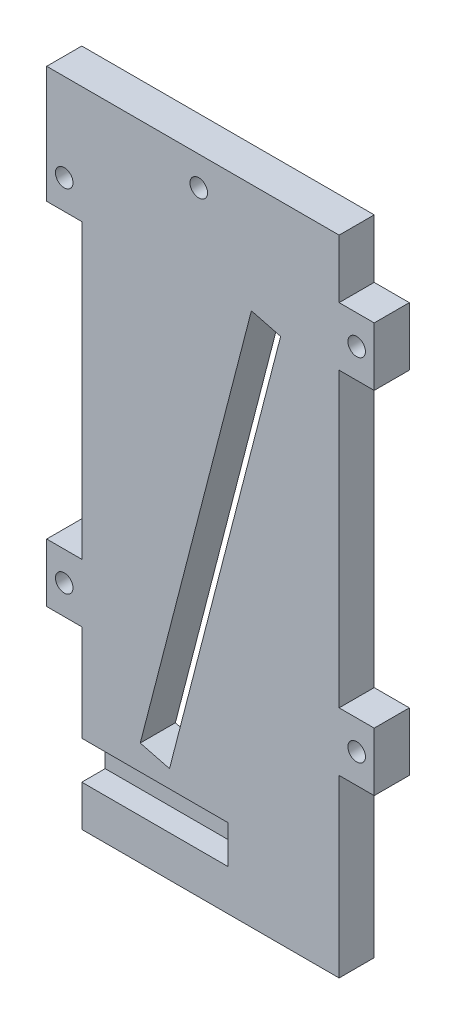
ISO-10303-21;
HEADER;
FILE_DESCRIPTION(('STEP AP214'),'2;1');
FILE_NAME('part.step','',(''),(''),'','','');
FILE_SCHEMA(('AUTOMOTIVE_DESIGN { 1 0 10303 214 1 1 1 1 }'));
ENDSEC;
DATA;
#1=APPLICATION_CONTEXT('core data for automotive mechanical design processes');
#2=APPLICATION_PROTOCOL_DEFINITION('international standard','automotive_design',2000,#1);
#3=PRODUCT_CONTEXT('',#1,'mechanical');
#4=PRODUCT('Part','Part','',(#3));
#5=PRODUCT_RELATED_PRODUCT_CATEGORY('part','',(#4));
#6=PRODUCT_DEFINITION_FORMATION('','',#4);
#7=PRODUCT_DEFINITION_CONTEXT('part definition',#1,'design');
#8=PRODUCT_DEFINITION('design','',#6,#7);
#9=PRODUCT_DEFINITION_SHAPE('','',#8);
#10=(LENGTH_UNIT() NAMED_UNIT(*) SI_UNIT(.MILLI.,.METRE.));
#11=(NAMED_UNIT(*) PLANE_ANGLE_UNIT() SI_UNIT($,.RADIAN.));
#12=(NAMED_UNIT(*) SI_UNIT($,.STERADIAN.) SOLID_ANGLE_UNIT());
#13=UNCERTAINTY_MEASURE_WITH_UNIT(LENGTH_MEASURE(1.E-05),#10,'distance_accuracy_value','');
#14=(GEOMETRIC_REPRESENTATION_CONTEXT(3) GLOBAL_UNCERTAINTY_ASSIGNED_CONTEXT((#13)) GLOBAL_UNIT_ASSIGNED_CONTEXT((#10,
#11,#12)) REPRESENTATION_CONTEXT('',''));
#15=CARTESIAN_POINT('',(0.,0.,0.));
#16=DIRECTION('',(0.,0.,1.));
#17=DIRECTION('',(1.,0.,0.));
#18=AXIS2_PLACEMENT_3D('',#15,#16,#17);
#19=CARTESIAN_POINT('',(-3.,75.,6.));
#20=DIRECTION('',(0.,0.,-1.));
#21=DIRECTION('',(-1.,0.,0.));
#22=AXIS2_PLACEMENT_3D('',#19,#20,#21);
#23=CYLINDRICAL_SURFACE('',#22,1.5);
#24=CARTESIAN_POINT('',(-3.,75.,6.));
#25=DIRECTION('',(0.,0.,-1.));
#26=DIRECTION('',(-1.,0.,0.));
#27=AXIS2_PLACEMENT_3D('',#24,#25,#26);
#28=CIRCLE('',#27,1.5);
#29=CARTESIAN_POINT('',(-4.5,75.,6.));
#30=VERTEX_POINT('',#29);
#31=EDGE_CURVE('E323',#30,#30,#28,.T.);
#32=ORIENTED_EDGE('',*,*,#31,.F.);
#33=EDGE_LOOP('',(#32));
#34=FACE_BOUND('',#33,.T.);
#35=CARTESIAN_POINT('',(-3.,75.,3.));
#36=DIRECTION('',(0.,0.,-1.));
#37=DIRECTION('',(-1.,0.,0.));
#38=AXIS2_PLACEMENT_3D('',#35,#36,#37);
#39=CIRCLE('',#38,1.5);
#40=CARTESIAN_POINT('',(-4.5,75.,3.));
#41=VERTEX_POINT('',#40);
#42=EDGE_CURVE('E303',#41,#41,#39,.F.);
#43=ORIENTED_EDGE('',*,*,#42,.F.);
#44=EDGE_LOOP('',(#43));
#45=FACE_BOUND('',#44,.T.);
#46=ADVANCED_FACE('F35',(#34,#45),#23,.F.);
#47=CARTESIAN_POINT('',(-3.,15.,6.));
#48=DIRECTION('',(0.,0.,-1.));
#49=DIRECTION('',(-1.,0.,0.));
#50=AXIS2_PLACEMENT_3D('',#47,#48,#49);
#51=CYLINDRICAL_SURFACE('',#50,1.5);
#52=CARTESIAN_POINT('',(-3.,15.,6.));
#53=DIRECTION('',(0.,0.,-1.));
#54=DIRECTION('',(-1.,0.,0.));
#55=AXIS2_PLACEMENT_3D('',#52,#53,#54);
#56=CIRCLE('',#55,1.5);
#57=CARTESIAN_POINT('',(-4.5,15.,6.));
#58=VERTEX_POINT('',#57);
#59=EDGE_CURVE('E320',#58,#58,#56,.T.);
#60=ORIENTED_EDGE('',*,*,#59,.F.);
#61=EDGE_LOOP('',(#60));
#62=FACE_BOUND('',#61,.T.);
#63=CARTESIAN_POINT('',(-3.,15.,3.));
#64=DIRECTION('',(0.,0.,-1.));
#65=DIRECTION('',(-1.,0.,0.));
#66=AXIS2_PLACEMENT_3D('',#63,#64,#65);
#67=CIRCLE('',#66,1.5);
#68=CARTESIAN_POINT('',(-4.5,15.,3.));
#69=VERTEX_POINT('',#68);
#70=EDGE_CURVE('E310',#69,#69,#67,.F.);
#71=ORIENTED_EDGE('',*,*,#70,.F.);
#72=EDGE_LOOP('',(#71));
#73=FACE_BOUND('',#72,.T.);
#74=ADVANCED_FACE('F473',(#62,#73),#51,.F.);
#75=CARTESIAN_POINT('',(0.,0.,6.));
#76=DIRECTION('',(1.,0.,0.));
#77=DIRECTION('',(0.,0.,-1.));
#78=AXIS2_PLACEMENT_3D('',#75,#76,#77);
#79=PLANE('',#78);
#80=DIRECTION('',(0.,-1.,0.));
#81=VECTOR('',#80,1.);
#82=CARTESIAN_POINT('',(0.,-13.,2.));
#83=LINE('',#82,#81);
#84=CARTESIAN_POINT('',(0.,-6.5,2.));
#85=VERTEX_POINT('',#84);
#86=CARTESIAN_POINT('',(0.,-13.,2.));
#87=VERTEX_POINT('',#86);
#88=EDGE_CURVE('E247',#85,#87,#83,.T.);
#89=ORIENTED_EDGE('',*,*,#88,.F.);
#90=DIRECTION('',(0.,0.,1.));
#91=VECTOR('',#90,1.);
#92=CARTESIAN_POINT('',(0.,-6.5,2.));
#93=LINE('',#92,#91);
#94=CARTESIAN_POINT('',(0.,-6.5,6.));
#95=VERTEX_POINT('',#94);
#96=EDGE_CURVE('E267',#85,#95,#93,.T.);
#97=ORIENTED_EDGE('',*,*,#96,.T.);
#98=DIRECTION('',(0.,-1.,0.));
#99=VECTOR('',#98,1.);
#100=CARTESIAN_POINT('',(0.,0.,6.));
#101=LINE('',#100,#99);
#102=CARTESIAN_POINT('',(0.,10.,6.));
#103=VERTEX_POINT('',#102);
#104=EDGE_CURVE('E333',#103,#95,#101,.T.);
#105=ORIENTED_EDGE('',*,*,#104,.F.);
#106=DIRECTION('',(0.,0.,-1.));
#107=VECTOR('',#106,1.);
#108=CARTESIAN_POINT('',(0.,10.,6.));
#109=LINE('',#108,#107);
#110=CARTESIAN_POINT('',(0.,10.,0.));
#111=VERTEX_POINT('',#110);
#112=EDGE_CURVE('E369',#103,#111,#109,.T.);
#113=ORIENTED_EDGE('',*,*,#112,.T.);
#114=DIRECTION('',(0.,-1.,0.));
#115=VECTOR('',#114,1.);
#116=CARTESIAN_POINT('',(0.,0.,0.));
#117=LINE('',#116,#115);
#118=CARTESIAN_POINT('',(0.,-20.,0.));
#119=VERTEX_POINT('',#118);
#120=EDGE_CURVE('E330',#111,#119,#117,.T.);
#121=ORIENTED_EDGE('',*,*,#120,.T.);
#122=DIRECTION('',(0.,0.,1.));
#123=VECTOR('',#122,1.);
#124=CARTESIAN_POINT('',(0.,-20.,0.));
#125=LINE('',#124,#123);
#126=CARTESIAN_POINT('',(0.,-20.,6.));
#127=VERTEX_POINT('',#126);
#128=EDGE_CURVE('E279',#119,#127,#125,.T.);
#129=ORIENTED_EDGE('',*,*,#128,.T.);
#130=CARTESIAN_POINT('',(0.,-13.,6.));
#131=VERTEX_POINT('',#130);
#132=EDGE_CURVE('E337',#131,#127,#101,.T.);
#133=ORIENTED_EDGE('',*,*,#132,.F.);
#134=DIRECTION('',(0.,0.,1.));
#135=VECTOR('',#134,1.);
#136=CARTESIAN_POINT('',(0.,-13.,2.));
#137=LINE('',#136,#135);
#138=EDGE_CURVE('E260',#87,#131,#137,.T.);
#139=ORIENTED_EDGE('',*,*,#138,.F.);
#140=EDGE_LOOP('',(#89,#97,#105,#113,#121,#129,#133,#139));
#141=FACE_BOUND('',#140,.T.);
#142=ADVANCED_FACE('F37',(#141),#79,.F.);
#143=CARTESIAN_POINT('',(44.,0.,6.));
#144=DIRECTION('',(-1.,0.,0.));
#145=DIRECTION('',(0.,0.,1.));
#146=AXIS2_PLACEMENT_3D('',#143,#144,#145);
#147=PLANE('',#146);
#148=DIRECTION('',(0.,1.,0.));
#149=VECTOR('',#148,1.);
#150=CARTESIAN_POINT('',(44.,0.,0.));
#151=LINE('',#150,#149);
#152=CARTESIAN_POINT('',(44.,-20.,0.));
#153=VERTEX_POINT('',#152);
#154=CARTESIAN_POINT('',(44.,10.,0.));
#155=VERTEX_POINT('',#154);
#156=EDGE_CURVE('E371',#153,#155,#151,.T.);
#157=ORIENTED_EDGE('',*,*,#156,.T.);
#158=DIRECTION('',(0.,0.,-1.));
#159=VECTOR('',#158,1.);
#160=CARTESIAN_POINT('',(44.,10.,6.));
#161=LINE('',#160,#159);
#162=CARTESIAN_POINT('',(44.,10.,6.));
#163=VERTEX_POINT('',#162);
#164=EDGE_CURVE('E11',#163,#155,#161,.T.);
#165=ORIENTED_EDGE('',*,*,#164,.F.);
#166=DIRECTION('',(0.,1.,0.));
#167=VECTOR('',#166,1.);
#168=CARTESIAN_POINT('',(44.,0.,6.));
#169=LINE('',#168,#167);
#170=CARTESIAN_POINT('',(44.,-20.,6.));
#171=VERTEX_POINT('',#170);
#172=EDGE_CURVE('E336',#171,#163,#169,.T.);
#173=ORIENTED_EDGE('',*,*,#172,.F.);
#174=DIRECTION('',(0.,0.,1.));
#175=VECTOR('',#174,1.);
#176=CARTESIAN_POINT('',(44.,-20.,0.));
#177=LINE('',#176,#175);
#178=EDGE_CURVE('E282',#153,#171,#177,.T.);
#179=ORIENTED_EDGE('',*,*,#178,.F.);
#180=EDGE_LOOP('',(#157,#165,#173,#179));
#181=FACE_BOUND('',#180,.T.);
#182=ADVANCED_FACE('F554',(#181),#147,.F.);
#183=CARTESIAN_POINT('',(44.,10.,6.));
#184=DIRECTION('',(0.,1.,0.));
#185=DIRECTION('',(0.,0.,1.));
#186=AXIS2_PLACEMENT_3D('',#183,#184,#185);
#187=PLANE('',#186);
#188=DIRECTION('',(1.,0.,0.));
#189=VECTOR('',#188,1.);
#190=CARTESIAN_POINT('',(44.,10.,0.));
#191=LINE('',#190,#189);
#192=CARTESIAN_POINT('',(50.,10.,0.));
#193=VERTEX_POINT('',#192);
#194=EDGE_CURVE('E373',#155,#193,#191,.T.);
#195=ORIENTED_EDGE('',*,*,#194,.T.);
#196=DIRECTION('',(0.,0.,-1.));
#197=VECTOR('',#196,1.);
#198=CARTESIAN_POINT('',(50.,10.,6.));
#199=LINE('',#198,#197);
#200=CARTESIAN_POINT('',(50.,10.,6.));
#201=VERTEX_POINT('',#200);
#202=EDGE_CURVE('E44',#201,#193,#199,.T.);
#203=ORIENTED_EDGE('',*,*,#202,.F.);
#204=DIRECTION('',(1.,0.,0.));
#205=VECTOR('',#204,1.);
#206=CARTESIAN_POINT('',(44.,10.,6.));
#207=LINE('',#206,#205);
#208=EDGE_CURVE('E339',#163,#201,#207,.T.);
#209=ORIENTED_EDGE('',*,*,#208,.F.);
#210=ORIENTED_EDGE('',*,*,#164,.T.);
#211=EDGE_LOOP('',(#195,#203,#209,#210));
#212=FACE_BOUND('',#211,.T.);
#213=ADVANCED_FACE('F551',(#212),#187,.F.);
#214=CARTESIAN_POINT('',(50.,10.,6.));
#215=DIRECTION('',(-1.,0.,0.));
#216=DIRECTION('',(0.,0.,1.));
#217=AXIS2_PLACEMENT_3D('',#214,#215,#216);
#218=PLANE('',#217);
#219=DIRECTION('',(0.,1.,0.));
#220=VECTOR('',#219,1.);
#221=CARTESIAN_POINT('',(50.,10.,0.));
#222=LINE('',#221,#220);
#223=CARTESIAN_POINT('',(50.,20.,0.));
#224=VERTEX_POINT('',#223);
#225=EDGE_CURVE('E375',#193,#224,#222,.T.);
#226=ORIENTED_EDGE('',*,*,#225,.T.);
#227=DIRECTION('',(0.,0.,-1.));
#228=VECTOR('',#227,1.);
#229=CARTESIAN_POINT('',(50.,20.,6.));
#230=LINE('',#229,#228);
#231=CARTESIAN_POINT('',(50.,20.,6.));
#232=VERTEX_POINT('',#231);
#233=EDGE_CURVE('E441',#232,#224,#230,.T.);
#234=ORIENTED_EDGE('',*,*,#233,.F.);
#235=DIRECTION('',(0.,1.,0.));
#236=VECTOR('',#235,1.);
#237=CARTESIAN_POINT('',(50.,10.,6.));
#238=LINE('',#237,#236);
#239=EDGE_CURVE('E341',#201,#232,#238,.T.);
#240=ORIENTED_EDGE('',*,*,#239,.F.);
#241=ORIENTED_EDGE('',*,*,#202,.T.);
#242=EDGE_LOOP('',(#226,#234,#240,#241));
#243=FACE_BOUND('',#242,.T.);
#244=ADVANCED_FACE('F547',(#243),#218,.F.);
#245=CARTESIAN_POINT('',(44.,20.,6.));
#246=DIRECTION('',(0.,-1.,0.));
#247=DIRECTION('',(0.,0.,-1.));
#248=AXIS2_PLACEMENT_3D('',#245,#246,#247);
#249=PLANE('',#248);
#250=DIRECTION('',(-1.,0.,0.));
#251=VECTOR('',#250,1.);
#252=CARTESIAN_POINT('',(44.,20.,0.));
#253=LINE('',#252,#251);
#254=CARTESIAN_POINT('',(44.,20.,0.));
#255=VERTEX_POINT('',#254);
#256=EDGE_CURVE('E377',#224,#255,#253,.T.);
#257=ORIENTED_EDGE('',*,*,#256,.T.);
#258=DIRECTION('',(0.,0.,-1.));
#259=VECTOR('',#258,1.);
#260=CARTESIAN_POINT('',(44.,20.,6.));
#261=LINE('',#260,#259);
#262=CARTESIAN_POINT('',(44.,20.,6.));
#263=VERTEX_POINT('',#262);
#264=EDGE_CURVE('E438',#263,#255,#261,.T.);
#265=ORIENTED_EDGE('',*,*,#264,.F.);
#266=DIRECTION('',(-1.,0.,0.));
#267=VECTOR('',#266,1.);
#268=CARTESIAN_POINT('',(44.,20.,6.));
#269=LINE('',#268,#267);
#270=EDGE_CURVE('E343',#232,#263,#269,.T.);
#271=ORIENTED_EDGE('',*,*,#270,.F.);
#272=ORIENTED_EDGE('',*,*,#233,.T.);
#273=EDGE_LOOP('',(#257,#265,#271,#272));
#274=FACE_BOUND('',#273,.T.);
#275=ADVANCED_FACE('F543',(#274),#249,.F.);
#276=CARTESIAN_POINT('',(44.,20.,6.));
#277=DIRECTION('',(-1.,0.,0.));
#278=DIRECTION('',(0.,-1.,0.));
#279=AXIS2_PLACEMENT_3D('',#276,#277,#278);
#280=PLANE('',#279);
#281=DIRECTION('',(0.,1.,0.));
#282=VECTOR('',#281,1.);
#283=CARTESIAN_POINT('',(44.,20.,0.));
#284=LINE('',#283,#282);
#285=CARTESIAN_POINT('',(44.,70.,0.));
#286=VERTEX_POINT('',#285);
#287=EDGE_CURVE('E379',#255,#286,#284,.T.);
#288=ORIENTED_EDGE('',*,*,#287,.T.);
#289=DIRECTION('',(0.,0.,-1.));
#290=VECTOR('',#289,1.);
#291=CARTESIAN_POINT('',(44.,70.,6.));
#292=LINE('',#291,#290);
#293=CARTESIAN_POINT('',(44.,70.,6.));
#294=VERTEX_POINT('',#293);
#295=EDGE_CURVE('E435',#294,#286,#292,.T.);
#296=ORIENTED_EDGE('',*,*,#295,.F.);
#297=DIRECTION('',(0.,1.,0.));
#298=VECTOR('',#297,1.);
#299=CARTESIAN_POINT('',(44.,20.,6.));
#300=LINE('',#299,#298);
#301=EDGE_CURVE('E345',#263,#294,#300,.T.);
#302=ORIENTED_EDGE('',*,*,#301,.F.);
#303=ORIENTED_EDGE('',*,*,#264,.T.);
#304=EDGE_LOOP('',(#288,#296,#302,#303));
#305=FACE_BOUND('',#304,.T.);
#306=ADVANCED_FACE('F539',(#305),#280,.F.);
#307=CARTESIAN_POINT('',(44.,70.,6.));
#308=DIRECTION('',(0.,1.,0.));
#309=DIRECTION('',(0.,0.,1.));
#310=AXIS2_PLACEMENT_3D('',#307,#308,#309);
#311=PLANE('',#310);
#312=DIRECTION('',(1.,0.,0.));
#313=VECTOR('',#312,1.);
#314=CARTESIAN_POINT('',(44.,70.,0.));
#315=LINE('',#314,#313);
#316=CARTESIAN_POINT('',(50.,70.,0.));
#317=VERTEX_POINT('',#316);
#318=EDGE_CURVE('E381',#286,#317,#315,.T.);
#319=ORIENTED_EDGE('',*,*,#318,.T.);
#320=DIRECTION('',(0.,0.,-1.));
#321=VECTOR('',#320,1.);
#322=CARTESIAN_POINT('',(50.,70.,6.));
#323=LINE('',#322,#321);
#324=CARTESIAN_POINT('',(50.,70.,6.));
#325=VERTEX_POINT('',#324);
#326=EDGE_CURVE('E432',#325,#317,#323,.T.);
#327=ORIENTED_EDGE('',*,*,#326,.F.);
#328=DIRECTION('',(1.,0.,0.));
#329=VECTOR('',#328,1.);
#330=CARTESIAN_POINT('',(44.,70.,6.));
#331=LINE('',#330,#329);
#332=EDGE_CURVE('E347',#294,#325,#331,.T.);
#333=ORIENTED_EDGE('',*,*,#332,.F.);
#334=ORIENTED_EDGE('',*,*,#295,.T.);
#335=EDGE_LOOP('',(#319,#327,#333,#334));
#336=FACE_BOUND('',#335,.T.);
#337=ADVANCED_FACE('F535',(#336),#311,.F.);
#338=CARTESIAN_POINT('',(50.,80.,6.));
#339=DIRECTION('',(-1.,0.,0.));
#340=DIRECTION('',(0.,0.,1.));
#341=AXIS2_PLACEMENT_3D('',#338,#339,#340);
#342=PLANE('',#341);
#343=DIRECTION('',(0.,1.,0.));
#344=VECTOR('',#343,1.);
#345=CARTESIAN_POINT('',(50.,80.,0.));
#346=LINE('',#345,#344);
#347=CARTESIAN_POINT('',(50.,80.,0.));
#348=VERTEX_POINT('',#347);
#349=EDGE_CURVE('E383',#317,#348,#346,.T.);
#350=ORIENTED_EDGE('',*,*,#349,.T.);
#351=DIRECTION('',(0.,0.,-1.));
#352=VECTOR('',#351,1.);
#353=CARTESIAN_POINT('',(50.,80.,6.));
#354=LINE('',#353,#352);
#355=CARTESIAN_POINT('',(50.,80.,6.));
#356=VERTEX_POINT('',#355);
#357=EDGE_CURVE('E429',#356,#348,#354,.T.);
#358=ORIENTED_EDGE('',*,*,#357,.F.);
#359=DIRECTION('',(0.,1.,0.));
#360=VECTOR('',#359,1.);
#361=CARTESIAN_POINT('',(50.,80.,6.));
#362=LINE('',#361,#360);
#363=EDGE_CURVE('E349',#325,#356,#362,.T.);
#364=ORIENTED_EDGE('',*,*,#363,.F.);
#365=ORIENTED_EDGE('',*,*,#326,.T.);
#366=EDGE_LOOP('',(#350,#358,#364,#365));
#367=FACE_BOUND('',#366,.T.);
#368=ADVANCED_FACE('F531',(#367),#342,.F.);
#369=CARTESIAN_POINT('',(44.,80.,6.));
#370=DIRECTION('',(0.,-1.,0.));
#371=DIRECTION('',(0.,0.,-1.));
#372=AXIS2_PLACEMENT_3D('',#369,#370,#371);
#373=PLANE('',#372);
#374=DIRECTION('',(-1.,0.,0.));
#375=VECTOR('',#374,1.);
#376=CARTESIAN_POINT('',(44.,80.,0.));
#377=LINE('',#376,#375);
#378=CARTESIAN_POINT('',(44.,80.,0.));
#379=VERTEX_POINT('',#378);
#380=EDGE_CURVE('E385',#348,#379,#377,.T.);
#381=ORIENTED_EDGE('',*,*,#380,.T.);
#382=DIRECTION('',(0.,0.,-1.));
#383=VECTOR('',#382,1.);
#384=CARTESIAN_POINT('',(44.,80.,6.));
#385=LINE('',#384,#383);
#386=CARTESIAN_POINT('',(44.,80.,6.));
#387=VERTEX_POINT('',#386);
#388=EDGE_CURVE('E426',#387,#379,#385,.T.);
#389=ORIENTED_EDGE('',*,*,#388,.F.);
#390=DIRECTION('',(-1.,0.,0.));
#391=VECTOR('',#390,1.);
#392=CARTESIAN_POINT('',(44.,80.,6.));
#393=LINE('',#392,#391);
#394=EDGE_CURVE('E351',#356,#387,#393,.T.);
#395=ORIENTED_EDGE('',*,*,#394,.F.);
#396=ORIENTED_EDGE('',*,*,#357,.T.);
#397=EDGE_LOOP('',(#381,#389,#395,#396));
#398=FACE_BOUND('',#397,.T.);
#399=ADVANCED_FACE('F527',(#398),#373,.F.);
#400=CARTESIAN_POINT('',(44.,80.,6.));
#401=DIRECTION('',(-1.,0.,0.));
#402=DIRECTION('',(0.,-1.,0.));
#403=AXIS2_PLACEMENT_3D('',#400,#401,#402);
#404=PLANE('',#403);
#405=DIRECTION('',(0.,1.,0.));
#406=VECTOR('',#405,1.);
#407=CARTESIAN_POINT('',(44.,80.,0.));
#408=LINE('',#407,#406);
#409=CARTESIAN_POINT('',(44.,90.,0.));
#410=VERTEX_POINT('',#409);
#411=EDGE_CURVE('E387',#379,#410,#408,.T.);
#412=ORIENTED_EDGE('',*,*,#411,.T.);
#413=DIRECTION('',(0.,0.,-1.));
#414=VECTOR('',#413,1.);
#415=CARTESIAN_POINT('',(44.,90.,6.));
#416=LINE('',#415,#414);
#417=CARTESIAN_POINT('',(44.,90.,6.));
#418=VERTEX_POINT('',#417);
#419=EDGE_CURVE('E423',#418,#410,#416,.T.);
#420=ORIENTED_EDGE('',*,*,#419,.F.);
#421=DIRECTION('',(0.,1.,0.));
#422=VECTOR('',#421,1.);
#423=CARTESIAN_POINT('',(44.,80.,6.));
#424=LINE('',#423,#422);
#425=EDGE_CURVE('E353',#387,#418,#424,.T.);
#426=ORIENTED_EDGE('',*,*,#425,.F.);
#427=ORIENTED_EDGE('',*,*,#388,.T.);
#428=EDGE_LOOP('',(#412,#420,#426,#427));
#429=FACE_BOUND('',#428,.T.);
#430=ADVANCED_FACE('F523',(#429),#404,.F.);
#431=CARTESIAN_POINT('',(-6.,90.,6.));
#432=DIRECTION('',(0.,-1.,0.));
#433=DIRECTION('',(0.,0.,-1.));
#434=AXIS2_PLACEMENT_3D('',#431,#432,#433);
#435=PLANE('',#434);
#436=DIRECTION('',(-1.,0.,0.));
#437=VECTOR('',#436,1.);
#438=CARTESIAN_POINT('',(-6.,90.,0.));
#439=LINE('',#438,#437);
#440=CARTESIAN_POINT('',(-6.,90.,0.));
#441=VERTEX_POINT('',#440);
#442=EDGE_CURVE('E389',#410,#441,#439,.T.);
#443=ORIENTED_EDGE('',*,*,#442,.T.);
#444=DIRECTION('',(0.,0.,-1.));
#445=VECTOR('',#444,1.);
#446=CARTESIAN_POINT('',(-6.,90.,6.));
#447=LINE('',#446,#445);
#448=CARTESIAN_POINT('',(-6.,90.,6.));
#449=VERTEX_POINT('',#448);
#450=EDGE_CURVE('E420',#449,#441,#447,.T.);
#451=ORIENTED_EDGE('',*,*,#450,.F.);
#452=DIRECTION('',(-1.,0.,0.));
#453=VECTOR('',#452,1.);
#454=CARTESIAN_POINT('',(-6.,90.,6.));
#455=LINE('',#454,#453);
#456=EDGE_CURVE('E355',#418,#449,#455,.T.);
#457=ORIENTED_EDGE('',*,*,#456,.F.);
#458=ORIENTED_EDGE('',*,*,#419,.T.);
#459=EDGE_LOOP('',(#443,#451,#457,#458));
#460=FACE_BOUND('',#459,.T.);
#461=ADVANCED_FACE('F519',(#460),#435,.F.);
#462=CARTESIAN_POINT('',(-6.,90.,6.));
#463=DIRECTION('',(1.,0.,0.));
#464=DIRECTION('',(0.,0.,-1.));
#465=AXIS2_PLACEMENT_3D('',#462,#463,#464);
#466=PLANE('',#465);
#467=DIRECTION('',(0.,-1.,0.));
#468=VECTOR('',#467,1.);
#469=CARTESIAN_POINT('',(-6.,90.,0.));
#470=LINE('',#469,#468);
#471=CARTESIAN_POINT('',(-6.,70.,0.));
#472=VERTEX_POINT('',#471);
#473=EDGE_CURVE('E391',#441,#472,#470,.T.);
#474=ORIENTED_EDGE('',*,*,#473,.T.);
#475=DIRECTION('',(0.,0.,-1.));
#476=VECTOR('',#475,1.);
#477=CARTESIAN_POINT('',(-6.,70.,6.));
#478=LINE('',#477,#476);
#479=CARTESIAN_POINT('',(-6.,70.,6.));
#480=VERTEX_POINT('',#479);
#481=EDGE_CURVE('E417',#480,#472,#478,.T.);
#482=ORIENTED_EDGE('',*,*,#481,.F.);
#483=DIRECTION('',(0.,-1.,0.));
#484=VECTOR('',#483,1.);
#485=CARTESIAN_POINT('',(-6.,90.,6.));
#486=LINE('',#485,#484);
#487=EDGE_CURVE('E357',#449,#480,#486,.T.);
#488=ORIENTED_EDGE('',*,*,#487,.F.);
#489=ORIENTED_EDGE('',*,*,#450,.T.);
#490=EDGE_LOOP('',(#474,#482,#488,#489));
#491=FACE_BOUND('',#490,.T.);
#492=ADVANCED_FACE('F515',(#491),#466,.F.);
#493=CARTESIAN_POINT('',(0.,70.,6.));
#494=DIRECTION('',(0.,1.,0.));
#495=DIRECTION('',(0.,0.,1.));
#496=AXIS2_PLACEMENT_3D('',#493,#494,#495);
#497=PLANE('',#496);
#498=DIRECTION('',(1.,0.,0.));
#499=VECTOR('',#498,1.);
#500=CARTESIAN_POINT('',(0.,70.,0.));
#501=LINE('',#500,#499);
#502=CARTESIAN_POINT('',(0.,70.,0.));
#503=VERTEX_POINT('',#502);
#504=EDGE_CURVE('E393',#472,#503,#501,.T.);
#505=ORIENTED_EDGE('',*,*,#504,.T.);
#506=DIRECTION('',(0.,0.,-1.));
#507=VECTOR('',#506,1.);
#508=CARTESIAN_POINT('',(0.,70.,6.));
#509=LINE('',#508,#507);
#510=CARTESIAN_POINT('',(0.,70.,6.));
#511=VERTEX_POINT('',#510);
#512=EDGE_CURVE('E414',#511,#503,#509,.T.);
#513=ORIENTED_EDGE('',*,*,#512,.F.);
#514=DIRECTION('',(1.,0.,0.));
#515=VECTOR('',#514,1.);
#516=CARTESIAN_POINT('',(0.,70.,6.));
#517=LINE('',#516,#515);
#518=EDGE_CURVE('E359',#480,#511,#517,.T.);
#519=ORIENTED_EDGE('',*,*,#518,.F.);
#520=ORIENTED_EDGE('',*,*,#481,.T.);
#521=EDGE_LOOP('',(#505,#513,#519,#520));
#522=FACE_BOUND('',#521,.T.);
#523=ADVANCED_FACE('F511',(#522),#497,.F.);
#524=CARTESIAN_POINT('',(0.,20.,6.));
#525=DIRECTION('',(1.,0.,0.));
#526=DIRECTION('',(0.,1.,0.));
#527=AXIS2_PLACEMENT_3D('',#524,#525,#526);
#528=PLANE('',#527);
#529=DIRECTION('',(0.,-1.,0.));
#530=VECTOR('',#529,1.);
#531=CARTESIAN_POINT('',(0.,20.,0.));
#532=LINE('',#531,#530);
#533=CARTESIAN_POINT('',(0.,20.,0.));
#534=VERTEX_POINT('',#533);
#535=EDGE_CURVE('E395',#503,#534,#532,.T.);
#536=ORIENTED_EDGE('',*,*,#535,.T.);
#537=DIRECTION('',(0.,0.,-1.));
#538=VECTOR('',#537,1.);
#539=CARTESIAN_POINT('',(0.,20.,6.));
#540=LINE('',#539,#538);
#541=CARTESIAN_POINT('',(0.,20.,6.));
#542=VERTEX_POINT('',#541);
#543=EDGE_CURVE('E411',#542,#534,#540,.T.);
#544=ORIENTED_EDGE('',*,*,#543,.F.);
#545=DIRECTION('',(0.,-1.,0.));
#546=VECTOR('',#545,1.);
#547=CARTESIAN_POINT('',(0.,20.,6.));
#548=LINE('',#547,#546);
#549=EDGE_CURVE('E361',#511,#542,#548,.T.);
#550=ORIENTED_EDGE('',*,*,#549,.F.);
#551=ORIENTED_EDGE('',*,*,#512,.T.);
#552=EDGE_LOOP('',(#536,#544,#550,#551));
#553=FACE_BOUND('',#552,.T.);
#554=ADVANCED_FACE('F507',(#553),#528,.F.);
#555=CARTESIAN_POINT('',(0.,20.,6.));
#556=DIRECTION('',(0.,-1.,0.));
#557=DIRECTION('',(0.,0.,-1.));
#558=AXIS2_PLACEMENT_3D('',#555,#556,#557);
#559=PLANE('',#558);
#560=DIRECTION('',(-1.,0.,0.));
#561=VECTOR('',#560,1.);
#562=CARTESIAN_POINT('',(0.,20.,0.));
#563=LINE('',#562,#561);
#564=CARTESIAN_POINT('',(-6.,20.,0.));
#565=VERTEX_POINT('',#564);
#566=EDGE_CURVE('E397',#534,#565,#563,.T.);
#567=ORIENTED_EDGE('',*,*,#566,.T.);
#568=DIRECTION('',(0.,0.,-1.));
#569=VECTOR('',#568,1.);
#570=CARTESIAN_POINT('',(-6.,20.,6.));
#571=LINE('',#570,#569);
#572=CARTESIAN_POINT('',(-6.,20.,6.));
#573=VERTEX_POINT('',#572);
#574=EDGE_CURVE('E408',#573,#565,#571,.T.);
#575=ORIENTED_EDGE('',*,*,#574,.F.);
#576=DIRECTION('',(-1.,0.,0.));
#577=VECTOR('',#576,1.);
#578=CARTESIAN_POINT('',(0.,20.,6.));
#579=LINE('',#578,#577);
#580=EDGE_CURVE('E363',#542,#573,#579,.T.);
#581=ORIENTED_EDGE('',*,*,#580,.F.);
#582=ORIENTED_EDGE('',*,*,#543,.T.);
#583=EDGE_LOOP('',(#567,#575,#581,#582));
#584=FACE_BOUND('',#583,.T.);
#585=ADVANCED_FACE('F503',(#584),#559,.F.);
#586=CARTESIAN_POINT('',(-6.,10.,6.));
#587=DIRECTION('',(1.,0.,0.));
#588=DIRECTION('',(0.,0.,-1.));
#589=AXIS2_PLACEMENT_3D('',#586,#587,#588);
#590=PLANE('',#589);
#591=DIRECTION('',(0.,-1.,0.));
#592=VECTOR('',#591,1.);
#593=CARTESIAN_POINT('',(-6.,10.,0.));
#594=LINE('',#593,#592);
#595=CARTESIAN_POINT('',(-6.,10.,0.));
#596=VERTEX_POINT('',#595);
#597=EDGE_CURVE('E399',#565,#596,#594,.T.);
#598=ORIENTED_EDGE('',*,*,#597,.T.);
#599=DIRECTION('',(0.,0.,-1.));
#600=VECTOR('',#599,1.);
#601=CARTESIAN_POINT('',(-6.,10.,6.));
#602=LINE('',#601,#600);
#603=CARTESIAN_POINT('',(-6.,10.,6.));
#604=VERTEX_POINT('',#603);
#605=EDGE_CURVE('E405',#604,#596,#602,.T.);
#606=ORIENTED_EDGE('',*,*,#605,.F.);
#607=DIRECTION('',(0.,-1.,0.));
#608=VECTOR('',#607,1.);
#609=CARTESIAN_POINT('',(-6.,10.,6.));
#610=LINE('',#609,#608);
#611=EDGE_CURVE('E365',#573,#604,#610,.T.);
#612=ORIENTED_EDGE('',*,*,#611,.F.);
#613=ORIENTED_EDGE('',*,*,#574,.T.);
#614=EDGE_LOOP('',(#598,#606,#612,#613));
#615=FACE_BOUND('',#614,.T.);
#616=ADVANCED_FACE('F499',(#615),#590,.F.);
#617=CARTESIAN_POINT('',(0.,10.,6.));
#618=DIRECTION('',(0.,1.,0.));
#619=DIRECTION('',(0.,0.,1.));
#620=AXIS2_PLACEMENT_3D('',#617,#618,#619);
#621=PLANE('',#620);
#622=DIRECTION('',(1.,0.,0.));
#623=VECTOR('',#622,1.);
#624=CARTESIAN_POINT('',(0.,10.,0.));
#625=LINE('',#624,#623);
#626=EDGE_CURVE('E401',#596,#111,#625,.T.);
#627=ORIENTED_EDGE('',*,*,#626,.T.);
#628=ORIENTED_EDGE('',*,*,#112,.F.);
#629=DIRECTION('',(1.,0.,0.));
#630=VECTOR('',#629,1.);
#631=CARTESIAN_POINT('',(0.,10.,6.));
#632=LINE('',#631,#630);
#633=EDGE_CURVE('E367',#604,#103,#632,.T.);
#634=ORIENTED_EDGE('',*,*,#633,.F.);
#635=ORIENTED_EDGE('',*,*,#605,.T.);
#636=EDGE_LOOP('',(#627,#628,#634,#635));
#637=FACE_BOUND('',#636,.T.);
#638=ADVANCED_FACE('F493',(#637),#621,.F.);
#639=CARTESIAN_POINT('',(0.,0.,6.));
#640=DIRECTION('',(0.,0.,1.));
#641=DIRECTION('',(1.,0.,0.));
#642=AXIS2_PLACEMENT_3D('',#639,#640,#641);
#643=PLANE('',#642);
#644=DIRECTION('',(-0.968174432456168,0.250276383900234,0.));
#645=VECTOR('',#644,1.);
#646=CARTESIAN_POINT('',(34.,70.,6.));
#647=LINE('',#646,#645);
#648=CARTESIAN_POINT('',(34.,70.,6.));
#649=VERTEX_POINT('',#648);
#650=CARTESIAN_POINT('',(29.,71.2925170068027,6.));
#651=VERTEX_POINT('',#650);
#652=EDGE_CURVE('E52',#649,#651,#647,.T.);
#653=ORIENTED_EDGE('',*,*,#652,.F.);
#654=DIRECTION('',(0.250276383900234,0.968174432456168,0.));
#655=VECTOR('',#654,1.);
#656=CARTESIAN_POINT('',(15.,-3.5,6.));
#657=LINE('',#656,#655);
#658=CARTESIAN_POINT('',(15.,-3.5,6.));
#659=VERTEX_POINT('',#658);
#660=EDGE_CURVE('E228',#659,#649,#657,.T.);
#661=ORIENTED_EDGE('',*,*,#660,.F.);
#662=DIRECTION('',(0.968174432456168,-0.250276383900234,0.));
#663=VECTOR('',#662,1.);
#664=CARTESIAN_POINT('',(10.,-2.20748299319728,6.));
#665=LINE('',#664,#663);
#666=CARTESIAN_POINT('',(10.,-2.20748299319728,6.));
#667=VERTEX_POINT('',#666);
#668=EDGE_CURVE('E231',#667,#659,#665,.T.);
#669=ORIENTED_EDGE('',*,*,#668,.F.);
#670=DIRECTION('',(-0.250276383900234,-0.968174432456168,0.));
#671=VECTOR('',#670,1.);
#672=CARTESIAN_POINT('',(29.,71.2925170068027,6.));
#673=LINE('',#672,#671);
#674=EDGE_CURVE('E237',#651,#667,#673,.T.);
#675=ORIENTED_EDGE('',*,*,#674,.F.);
#676=EDGE_LOOP('',(#653,#661,#669,#675));
#677=FACE_BOUND('',#676,.T.);
#678=DIRECTION('',(-1.,0.,0.));
#679=VECTOR('',#678,1.);
#680=CARTESIAN_POINT('',(0.,-6.5,6.));
#681=LINE('',#680,#679);
#682=CARTESIAN_POINT('',(25.,-6.5,6.));
#683=VERTEX_POINT('',#682);
#684=EDGE_CURVE('E251',#683,#95,#681,.T.);
#685=ORIENTED_EDGE('',*,*,#684,.F.);
#686=DIRECTION('',(0.,1.,0.));
#687=VECTOR('',#686,1.);
#688=CARTESIAN_POINT('',(25.,-13.,6.));
#689=LINE('',#688,#687);
#690=CARTESIAN_POINT('',(25.,-13.,6.));
#691=VERTEX_POINT('',#690);
#692=EDGE_CURVE('E263',#691,#683,#689,.T.);
#693=ORIENTED_EDGE('',*,*,#692,.F.);
#694=DIRECTION('',(1.,0.,0.));
#695=VECTOR('',#694,1.);
#696=CARTESIAN_POINT('',(0.,-13.,6.));
#697=LINE('',#696,#695);
#698=EDGE_CURVE('E243',#131,#691,#697,.T.);
#699=ORIENTED_EDGE('',*,*,#698,.F.);
#700=ORIENTED_EDGE('',*,*,#132,.T.);
#701=DIRECTION('',(1.,0.,0.));
#702=VECTOR('',#701,1.);
#703=CARTESIAN_POINT('',(0.,-20.,6.));
#704=LINE('',#703,#702);
#705=EDGE_CURVE('E270',#127,#171,#704,.T.);
#706=ORIENTED_EDGE('',*,*,#705,.T.);
#707=ORIENTED_EDGE('',*,*,#172,.T.);
#708=ORIENTED_EDGE('',*,*,#208,.T.);
#709=ORIENTED_EDGE('',*,*,#239,.T.);
#710=ORIENTED_EDGE('',*,*,#270,.T.);
#711=ORIENTED_EDGE('',*,*,#301,.T.);
#712=ORIENTED_EDGE('',*,*,#332,.T.);
#713=ORIENTED_EDGE('',*,*,#363,.T.);
#714=ORIENTED_EDGE('',*,*,#394,.T.);
#715=ORIENTED_EDGE('',*,*,#425,.T.);
#716=ORIENTED_EDGE('',*,*,#456,.T.);
#717=ORIENTED_EDGE('',*,*,#487,.T.);
#718=ORIENTED_EDGE('',*,*,#518,.T.);
#719=ORIENTED_EDGE('',*,*,#549,.T.);
#720=ORIENTED_EDGE('',*,*,#580,.T.);
#721=ORIENTED_EDGE('',*,*,#611,.T.);
#722=ORIENTED_EDGE('',*,*,#633,.T.);
#723=ORIENTED_EDGE('',*,*,#104,.T.);
#724=EDGE_LOOP('',(#685,#693,#699,#700,#706,#707,#708,#709,#710,#711,#712,#713,#714,#715,#716,
#717,#718,#719,#720,#721,#722,#723));
#725=FACE_BOUND('',#724,.T.);
#726=CARTESIAN_POINT('',(47.,75.,6.));
#727=DIRECTION('',(0.,0.,-1.));
#728=DIRECTION('',(1.,0.,0.));
#729=AXIS2_PLACEMENT_3D('',#726,#727,#728);
#730=CIRCLE('',#729,1.5);
#731=CARTESIAN_POINT('',(48.5,75.,6.));
#732=VERTEX_POINT('',#731);
#733=EDGE_CURVE('E314',#732,#732,#730,.T.);
#734=ORIENTED_EDGE('',*,*,#733,.T.);
#735=EDGE_LOOP('',(#734));
#736=FACE_BOUND('',#735,.T.);
#737=CARTESIAN_POINT('',(47.,15.,6.));
#738=DIRECTION('',(0.,0.,-1.));
#739=DIRECTION('',(1.,0.,0.));
#740=AXIS2_PLACEMENT_3D('',#737,#738,#739);
#741=CIRCLE('',#740,1.5);
#742=CARTESIAN_POINT('',(48.5,15.,6.));
#743=VERTEX_POINT('',#742);
#744=EDGE_CURVE('E317',#743,#743,#741,.T.);
#745=ORIENTED_EDGE('',*,*,#744,.T.);
#746=EDGE_LOOP('',(#745));
#747=FACE_BOUND('',#746,.T.);
#748=ORIENTED_EDGE('',*,*,#59,.T.);
#749=EDGE_LOOP('',(#748));
#750=FACE_BOUND('',#749,.T.);
#751=ORIENTED_EDGE('',*,*,#31,.T.);
#752=EDGE_LOOP('',(#751));
#753=FACE_BOUND('',#752,.T.);
#754=CARTESIAN_POINT('',(20.,85.,6.));
#755=DIRECTION('',(0.,0.,1.));
#756=DIRECTION('',(1.,0.,0.));
#757=AXIS2_PLACEMENT_3D('',#754,#755,#756);
#758=CIRCLE('',#757,1.5);
#759=CARTESIAN_POINT('',(21.5,85.,6.));
#760=VERTEX_POINT('',#759);
#761=EDGE_CURVE('E326',#760,#760,#758,.T.);
#762=ORIENTED_EDGE('',*,*,#761,.F.);
#763=EDGE_LOOP('',(#762));
#764=FACE_BOUND('',#763,.T.);
#765=ADVANCED_FACE('F490',(#677,#725,#736,#747,#750,#753,#764),#643,.T.);
#766=CARTESIAN_POINT('',(0.,0.,0.));
#767=DIRECTION('',(0.,0.,1.));
#768=DIRECTION('',(1.,0.,0.));
#769=AXIS2_PLACEMENT_3D('',#766,#767,#768);
#770=PLANE('',#769);
#771=DIRECTION('',(0.250276383900234,0.968174432456168,0.));
#772=VECTOR('',#771,1.);
#773=CARTESIAN_POINT('',(15.,-3.5,0.));
#774=LINE('',#773,#772);
#775=CARTESIAN_POINT('',(15.,-3.5,0.));
#776=VERTEX_POINT('',#775);
#777=CARTESIAN_POINT('',(34.,70.,0.));
#778=VERTEX_POINT('',#777);
#779=EDGE_CURVE('E218',#776,#778,#774,.T.);
#780=ORIENTED_EDGE('',*,*,#779,.T.);
#781=DIRECTION('',(-0.968174432456168,0.250276383900234,0.));
#782=VECTOR('',#781,1.);
#783=CARTESIAN_POINT('',(34.,70.,0.));
#784=LINE('',#783,#782);
#785=CARTESIAN_POINT('',(29.,71.2925170068027,0.));
#786=VERTEX_POINT('',#785);
#787=EDGE_CURVE('E212',#778,#786,#784,.T.);
#788=ORIENTED_EDGE('',*,*,#787,.T.);
#789=DIRECTION('',(-0.250276383900234,-0.968174432456168,0.));
#790=VECTOR('',#789,1.);
#791=CARTESIAN_POINT('',(29.,71.2925170068027,0.));
#792=LINE('',#791,#790);
#793=CARTESIAN_POINT('',(10.,-2.20748299319728,0.));
#794=VERTEX_POINT('',#793);
#795=EDGE_CURVE('E221',#786,#794,#792,.T.);
#796=ORIENTED_EDGE('',*,*,#795,.T.);
#797=DIRECTION('',(0.968174432456168,-0.250276383900234,0.));
#798=VECTOR('',#797,1.);
#799=CARTESIAN_POINT('',(10.,-2.20748299319728,0.));
#800=LINE('',#799,#798);
#801=EDGE_CURVE('E60',#794,#776,#800,.T.);
#802=ORIENTED_EDGE('',*,*,#801,.T.);
#803=EDGE_LOOP('',(#780,#788,#796,#802));
#804=FACE_BOUND('',#803,.T.);
#805=CARTESIAN_POINT('',(47.,15.,0.));
#806=DIRECTION('',(0.,0.,-1.));
#807=DIRECTION('',(1.,0.,0.));
#808=AXIS2_PLACEMENT_3D('',#805,#806,#807);
#809=CIRCLE('',#808,2.995);
#810=CARTESIAN_POINT('',(49.995,15.,0.));
#811=VERTEX_POINT('',#810);
#812=EDGE_CURVE('E285',#811,#811,#809,.T.);
#813=ORIENTED_EDGE('',*,*,#812,.F.);
#814=EDGE_LOOP('',(#813));
#815=FACE_BOUND('',#814,.T.);
#816=CARTESIAN_POINT('',(47.,75.,0.));
#817=DIRECTION('',(0.,0.,-1.));
#818=DIRECTION('',(1.,0.,0.));
#819=AXIS2_PLACEMENT_3D('',#816,#817,#818);
#820=CIRCLE('',#819,2.995);
#821=CARTESIAN_POINT('',(49.995,75.,0.));
#822=VERTEX_POINT('',#821);
#823=EDGE_CURVE('E297',#822,#822,#820,.T.);
#824=ORIENTED_EDGE('',*,*,#823,.F.);
#825=EDGE_LOOP('',(#824));
#826=FACE_BOUND('',#825,.T.);
#827=CARTESIAN_POINT('',(-3.,75.,0.));
#828=DIRECTION('',(0.,0.,-1.));
#829=DIRECTION('',(-1.,0.,0.));
#830=AXIS2_PLACEMENT_3D('',#827,#828,#829);
#831=CIRCLE('',#830,2.995);
#832=CARTESIAN_POINT('',(-5.995,75.,0.));
#833=VERTEX_POINT('',#832);
#834=EDGE_CURVE('E304',#833,#833,#831,.T.);
#835=ORIENTED_EDGE('',*,*,#834,.F.);
#836=EDGE_LOOP('',(#835));
#837=FACE_BOUND('',#836,.T.);
#838=CARTESIAN_POINT('',(-3.,15.,0.));
#839=DIRECTION('',(0.,0.,-1.));
#840=DIRECTION('',(-1.,0.,0.));
#841=AXIS2_PLACEMENT_3D('',#838,#839,#840);
#842=CIRCLE('',#841,2.995);
#843=CARTESIAN_POINT('',(-5.995,15.,0.));
#844=VERTEX_POINT('',#843);
#845=EDGE_CURVE('E311',#844,#844,#842,.T.);
#846=ORIENTED_EDGE('',*,*,#845,.F.);
#847=EDGE_LOOP('',(#846));
#848=FACE_BOUND('',#847,.T.);
#849=CARTESIAN_POINT('',(20.,85.,0.));
#850=DIRECTION('',(0.,0.,1.));
#851=DIRECTION('',(1.,0.,0.));
#852=AXIS2_PLACEMENT_3D('',#849,#850,#851);
#853=CIRCLE('',#852,1.5);
#854=CARTESIAN_POINT('',(21.5,85.,0.));
#855=VERTEX_POINT('',#854);
#856=EDGE_CURVE('E327',#855,#855,#853,.T.);
#857=ORIENTED_EDGE('',*,*,#856,.T.);
#858=EDGE_LOOP('',(#857));
#859=FACE_BOUND('',#858,.T.);
#860=ORIENTED_EDGE('',*,*,#120,.F.);
#861=ORIENTED_EDGE('',*,*,#626,.F.);
#862=ORIENTED_EDGE('',*,*,#597,.F.);
#863=ORIENTED_EDGE('',*,*,#566,.F.);
#864=ORIENTED_EDGE('',*,*,#535,.F.);
#865=ORIENTED_EDGE('',*,*,#504,.F.);
#866=ORIENTED_EDGE('',*,*,#473,.F.);
#867=ORIENTED_EDGE('',*,*,#442,.F.);
#868=ORIENTED_EDGE('',*,*,#411,.F.);
#869=ORIENTED_EDGE('',*,*,#380,.F.);
#870=ORIENTED_EDGE('',*,*,#349,.F.);
#871=ORIENTED_EDGE('',*,*,#318,.F.);
#872=ORIENTED_EDGE('',*,*,#287,.F.);
#873=ORIENTED_EDGE('',*,*,#256,.F.);
#874=ORIENTED_EDGE('',*,*,#225,.F.);
#875=ORIENTED_EDGE('',*,*,#194,.F.);
#876=ORIENTED_EDGE('',*,*,#156,.F.);
#877=DIRECTION('',(1.,0.,0.));
#878=VECTOR('',#877,1.);
#879=CARTESIAN_POINT('',(0.,-20.,0.));
#880=LINE('',#879,#878);
#881=EDGE_CURVE('E276',#119,#153,#880,.T.);
#882=ORIENTED_EDGE('',*,*,#881,.F.);
#883=EDGE_LOOP('',(#860,#861,#862,#863,#864,#865,#866,#867,#868,#869,#870,#871,#872,#873,#874,
#875,#876,#882));
#884=FACE_BOUND('',#883,.T.);
#885=ADVANCED_FACE('F225',(#804,#815,#826,#837,#848,#859,#884),#770,.F.);
#886=CARTESIAN_POINT('',(20.,85.,0.));
#887=DIRECTION('',(0.,0.,1.));
#888=DIRECTION('',(1.,0.,0.));
#889=AXIS2_PLACEMENT_3D('',#886,#887,#888);
#890=CYLINDRICAL_SURFACE('',#889,1.5);
#891=ORIENTED_EDGE('',*,*,#856,.F.);
#892=EDGE_LOOP('',(#891));
#893=FACE_BOUND('',#892,.T.);
#894=ORIENTED_EDGE('',*,*,#761,.T.);
#895=EDGE_LOOP('',(#894));
#896=FACE_BOUND('',#895,.T.);
#897=ADVANCED_FACE('F485',(#893,#896),#890,.F.);
#898=CARTESIAN_POINT('',(47.,15.,6.));
#899=DIRECTION('',(0.,0.,-1.));
#900=DIRECTION('',(-1.,0.,0.));
#901=AXIS2_PLACEMENT_3D('',#898,#899,#900);
#902=CYLINDRICAL_SURFACE('',#901,1.5);
#903=CARTESIAN_POINT('',(47.,15.,3.));
#904=DIRECTION('',(0.,0.,1.));
#905=DIRECTION('',(1.,0.,0.));
#906=AXIS2_PLACEMENT_3D('',#903,#904,#905);
#907=CIRCLE('',#906,1.5);
#908=CARTESIAN_POINT('',(48.5,15.,3.));
#909=VERTEX_POINT('',#908);
#910=EDGE_CURVE('E39',#909,#909,#907,.F.);
#911=ORIENTED_EDGE('',*,*,#910,.T.);
#912=EDGE_LOOP('',(#911));
#913=FACE_BOUND('',#912,.T.);
#914=ORIENTED_EDGE('',*,*,#744,.F.);
#915=EDGE_LOOP('',(#914));
#916=FACE_BOUND('',#915,.T.);
#917=ADVANCED_FACE('F488',(#913,#916),#902,.F.);
#918=CARTESIAN_POINT('',(47.,75.,6.));
#919=DIRECTION('',(0.,0.,-1.));
#920=DIRECTION('',(-1.,0.,0.));
#921=AXIS2_PLACEMENT_3D('',#918,#919,#920);
#922=CYLINDRICAL_SURFACE('',#921,1.5);
#923=CARTESIAN_POINT('',(47.,75.,3.));
#924=DIRECTION('',(0.,0.,1.));
#925=DIRECTION('',(1.,0.,0.));
#926=AXIS2_PLACEMENT_3D('',#923,#924,#925);
#927=CIRCLE('',#926,1.5);
#928=CARTESIAN_POINT('',(48.5,75.,3.));
#929=VERTEX_POINT('',#928);
#930=EDGE_CURVE('E296',#929,#929,#927,.F.);
#931=ORIENTED_EDGE('',*,*,#930,.T.);
#932=EDGE_LOOP('',(#931));
#933=FACE_BOUND('',#932,.T.);
#934=ORIENTED_EDGE('',*,*,#733,.F.);
#935=EDGE_LOOP('',(#934));
#936=FACE_BOUND('',#935,.T.);
#937=ADVANCED_FACE('F452',(#933,#936),#922,.F.);
#938=CARTESIAN_POINT('',(-3.,15.,3.));
#939=DIRECTION('',(0.,0.,-1.));
#940=DIRECTION('',(-1.,0.,0.));
#941=AXIS2_PLACEMENT_3D('',#938,#939,#940);
#942=PLANE('',#941);
#943=CARTESIAN_POINT('',(-3.,15.,3.));
#944=DIRECTION('',(0.,0.,-1.));
#945=DIRECTION('',(-1.,0.,0.));
#946=AXIS2_PLACEMENT_3D('',#943,#944,#945);
#947=CIRCLE('',#946,2.995);
#948=CARTESIAN_POINT('',(-5.995,15.,3.));
#949=VERTEX_POINT('',#948);
#950=EDGE_CURVE('E307',#949,#949,#947,.T.);
#951=ORIENTED_EDGE('',*,*,#950,.T.);
#952=EDGE_LOOP('',(#951));
#953=FACE_BOUND('',#952,.T.);
#954=ORIENTED_EDGE('',*,*,#70,.T.);
#955=EDGE_LOOP('',(#954));
#956=FACE_BOUND('',#955,.T.);
#957=ADVANCED_FACE('F671',(#953,#956),#942,.T.);
#958=CARTESIAN_POINT('',(-3.,15.,3.));
#959=DIRECTION('',(0.,0.,-1.));
#960=DIRECTION('',(-1.,0.,0.));
#961=AXIS2_PLACEMENT_3D('',#958,#959,#960);
#962=CYLINDRICAL_SURFACE('',#961,2.995);
#963=ORIENTED_EDGE('',*,*,#950,.F.);
#964=EDGE_LOOP('',(#963));
#965=FACE_BOUND('',#964,.T.);
#966=ORIENTED_EDGE('',*,*,#845,.T.);
#967=EDGE_LOOP('',(#966));
#968=FACE_BOUND('',#967,.T.);
#969=ADVANCED_FACE('F669',(#965,#968),#962,.F.);
#970=CARTESIAN_POINT('',(-3.,75.,3.));
#971=DIRECTION('',(0.,0.,-1.));
#972=DIRECTION('',(-1.,0.,0.));
#973=AXIS2_PLACEMENT_3D('',#970,#971,#972);
#974=PLANE('',#973);
#975=CARTESIAN_POINT('',(-3.,75.,3.));
#976=DIRECTION('',(0.,0.,-1.));
#977=DIRECTION('',(-1.,0.,0.));
#978=AXIS2_PLACEMENT_3D('',#975,#976,#977);
#979=CIRCLE('',#978,2.995);
#980=CARTESIAN_POINT('',(-5.995,75.,3.));
#981=VERTEX_POINT('',#980);
#982=EDGE_CURVE('E300',#981,#981,#979,.T.);
#983=ORIENTED_EDGE('',*,*,#982,.T.);
#984=EDGE_LOOP('',(#983));
#985=FACE_BOUND('',#984,.T.);
#986=ORIENTED_EDGE('',*,*,#42,.T.);
#987=EDGE_LOOP('',(#986));
#988=FACE_BOUND('',#987,.T.);
#989=ADVANCED_FACE('F468',(#985,#988),#974,.T.);
#990=CARTESIAN_POINT('',(-3.,75.,3.));
#991=DIRECTION('',(0.,0.,-1.));
#992=DIRECTION('',(-1.,0.,0.));
#993=AXIS2_PLACEMENT_3D('',#990,#991,#992);
#994=CYLINDRICAL_SURFACE('',#993,2.995);
#995=ORIENTED_EDGE('',*,*,#982,.F.);
#996=EDGE_LOOP('',(#995));
#997=FACE_BOUND('',#996,.T.);
#998=ORIENTED_EDGE('',*,*,#834,.T.);
#999=EDGE_LOOP('',(#998));
#1000=FACE_BOUND('',#999,.T.);
#1001=ADVANCED_FACE('F458',(#997,#1000),#994,.F.);
#1002=CARTESIAN_POINT('',(47.,75.,3.));
#1003=DIRECTION('',(0.,0.,1.));
#1004=DIRECTION('',(1.,0.,0.));
#1005=AXIS2_PLACEMENT_3D('',#1002,#1003,#1004);
#1006=PLANE('',#1005);
#1007=CARTESIAN_POINT('',(47.,75.,3.));
#1008=DIRECTION('',(0.,0.,-1.));
#1009=DIRECTION('',(1.,0.,0.));
#1010=AXIS2_PLACEMENT_3D('',#1007,#1008,#1009);
#1011=CIRCLE('',#1010,2.995);
#1012=CARTESIAN_POINT('',(49.995,75.,3.));
#1013=VERTEX_POINT('',#1012);
#1014=EDGE_CURVE('E293',#1013,#1013,#1011,.T.);
#1015=ORIENTED_EDGE('',*,*,#1014,.T.);
#1016=EDGE_LOOP('',(#1015));
#1017=FACE_BOUND('',#1016,.T.);
#1018=ORIENTED_EDGE('',*,*,#930,.F.);
#1019=EDGE_LOOP('',(#1018));
#1020=FACE_BOUND('',#1019,.T.);
#1021=ADVANCED_FACE('F455',(#1017,#1020),#1006,.F.);
#1022=CARTESIAN_POINT('',(47.,75.,3.));
#1023=DIRECTION('',(0.,0.,-1.));
#1024=DIRECTION('',(-1.,0.,0.));
#1025=AXIS2_PLACEMENT_3D('',#1022,#1023,#1024);
#1026=CYLINDRICAL_SURFACE('',#1025,2.995);
#1027=ORIENTED_EDGE('',*,*,#1014,.F.);
#1028=EDGE_LOOP('',(#1027));
#1029=FACE_BOUND('',#1028,.T.);
#1030=ORIENTED_EDGE('',*,*,#823,.T.);
#1031=EDGE_LOOP('',(#1030));
#1032=FACE_BOUND('',#1031,.T.);
#1033=ADVANCED_FACE('F457',(#1029,#1032),#1026,.F.);
#1034=CARTESIAN_POINT('',(47.,15.,3.));
#1035=DIRECTION('',(0.,0.,1.));
#1036=DIRECTION('',(1.,0.,0.));
#1037=AXIS2_PLACEMENT_3D('',#1034,#1035,#1036);
#1038=PLANE('',#1037);
#1039=CARTESIAN_POINT('',(47.,15.,3.));
#1040=DIRECTION('',(0.,0.,-1.));
#1041=DIRECTION('',(1.,0.,0.));
#1042=AXIS2_PLACEMENT_3D('',#1039,#1040,#1041);
#1043=CIRCLE('',#1042,2.995);
#1044=CARTESIAN_POINT('',(49.995,15.,3.));
#1045=VERTEX_POINT('',#1044);
#1046=EDGE_CURVE('E288',#1045,#1045,#1043,.T.);
#1047=ORIENTED_EDGE('',*,*,#1046,.T.);
#1048=EDGE_LOOP('',(#1047));
#1049=FACE_BOUND('',#1048,.T.);
#1050=ORIENTED_EDGE('',*,*,#910,.F.);
#1051=EDGE_LOOP('',(#1050));
#1052=FACE_BOUND('',#1051,.T.);
#1053=ADVANCED_FACE('F465',(#1049,#1052),#1038,.F.);
#1054=CARTESIAN_POINT('',(47.,15.,3.));
#1055=DIRECTION('',(0.,0.,-1.));
#1056=DIRECTION('',(-1.,0.,0.));
#1057=AXIS2_PLACEMENT_3D('',#1054,#1055,#1056);
#1058=CYLINDRICAL_SURFACE('',#1057,2.995);
#1059=ORIENTED_EDGE('',*,*,#1046,.F.);
#1060=EDGE_LOOP('',(#1059));
#1061=FACE_BOUND('',#1060,.T.);
#1062=ORIENTED_EDGE('',*,*,#812,.T.);
#1063=EDGE_LOOP('',(#1062));
#1064=FACE_BOUND('',#1063,.T.);
#1065=ADVANCED_FACE('F647',(#1061,#1064),#1058,.F.);
#1066=CARTESIAN_POINT('',(0.,-20.,0.));
#1067=DIRECTION('',(0.,-1.,0.));
#1068=DIRECTION('',(0.,0.,-1.));
#1069=AXIS2_PLACEMENT_3D('',#1066,#1067,#1068);
#1070=PLANE('',#1069);
#1071=ORIENTED_EDGE('',*,*,#705,.F.);
#1072=ORIENTED_EDGE('',*,*,#128,.F.);
#1073=ORIENTED_EDGE('',*,*,#881,.T.);
#1074=ORIENTED_EDGE('',*,*,#178,.T.);
#1075=EDGE_LOOP('',(#1071,#1072,#1073,#1074));
#1076=FACE_BOUND('',#1075,.T.);
#1077=ADVANCED_FACE('F584',(#1076),#1070,.T.);
#1078=CARTESIAN_POINT('',(0.,-6.5,2.));
#1079=DIRECTION('',(0.,1.,0.));
#1080=DIRECTION('',(0.,0.,1.));
#1081=AXIS2_PLACEMENT_3D('',#1078,#1079,#1080);
#1082=PLANE('',#1081);
#1083=ORIENTED_EDGE('',*,*,#684,.T.);
#1084=ORIENTED_EDGE('',*,*,#96,.F.);
#1085=DIRECTION('',(-1.,0.,0.));
#1086=VECTOR('',#1085,1.);
#1087=CARTESIAN_POINT('',(0.,-6.5,2.));
#1088=LINE('',#1087,#1086);
#1089=CARTESIAN_POINT('',(25.,-6.5,2.));
#1090=VERTEX_POINT('',#1089);
#1091=EDGE_CURVE('E257',#1090,#85,#1088,.T.);
#1092=ORIENTED_EDGE('',*,*,#1091,.F.);
#1093=DIRECTION('',(0.,0.,1.));
#1094=VECTOR('',#1093,1.);
#1095=CARTESIAN_POINT('',(25.,-6.5,2.));
#1096=LINE('',#1095,#1094);
#1097=EDGE_CURVE('E271',#1090,#683,#1096,.T.);
#1098=ORIENTED_EDGE('',*,*,#1097,.T.);
#1099=EDGE_LOOP('',(#1083,#1084,#1092,#1098));
#1100=FACE_BOUND('',#1099,.T.);
#1101=ADVANCED_FACE('F625',(#1100),#1082,.F.);
#1102=CARTESIAN_POINT('',(25.,-13.,2.));
#1103=DIRECTION('',(1.,0.,0.));
#1104=DIRECTION('',(0.,0.,-1.));
#1105=AXIS2_PLACEMENT_3D('',#1102,#1103,#1104);
#1106=PLANE('',#1105);
#1107=ORIENTED_EDGE('',*,*,#692,.T.);
#1108=ORIENTED_EDGE('',*,*,#1097,.F.);
#1109=DIRECTION('',(0.,1.,0.));
#1110=VECTOR('',#1109,1.);
#1111=CARTESIAN_POINT('',(25.,-13.,2.));
#1112=LINE('',#1111,#1110);
#1113=CARTESIAN_POINT('',(25.,-13.,2.));
#1114=VERTEX_POINT('',#1113);
#1115=EDGE_CURVE('E254',#1114,#1090,#1112,.T.);
#1116=ORIENTED_EDGE('',*,*,#1115,.F.);
#1117=DIRECTION('',(0.,0.,1.));
#1118=VECTOR('',#1117,1.);
#1119=CARTESIAN_POINT('',(25.,-13.,2.));
#1120=LINE('',#1119,#1118);
#1121=EDGE_CURVE('E273',#1114,#691,#1120,.T.);
#1122=ORIENTED_EDGE('',*,*,#1121,.T.);
#1123=EDGE_LOOP('',(#1107,#1108,#1116,#1122));
#1124=FACE_BOUND('',#1123,.T.);
#1125=ADVANCED_FACE('F632',(#1124),#1106,.F.);
#1126=CARTESIAN_POINT('',(0.,-13.,2.));
#1127=DIRECTION('',(0.,-1.,0.));
#1128=DIRECTION('',(0.,0.,-1.));
#1129=AXIS2_PLACEMENT_3D('',#1126,#1127,#1128);
#1130=PLANE('',#1129);
#1131=ORIENTED_EDGE('',*,*,#698,.T.);
#1132=ORIENTED_EDGE('',*,*,#1121,.F.);
#1133=DIRECTION('',(1.,0.,0.));
#1134=VECTOR('',#1133,1.);
#1135=CARTESIAN_POINT('',(0.,-13.,2.));
#1136=LINE('',#1135,#1134);
#1137=EDGE_CURVE('E250',#87,#1114,#1136,.T.);
#1138=ORIENTED_EDGE('',*,*,#1137,.F.);
#1139=ORIENTED_EDGE('',*,*,#138,.T.);
#1140=EDGE_LOOP('',(#1131,#1132,#1138,#1139));
#1141=FACE_BOUND('',#1140,.T.);
#1142=ADVANCED_FACE('F634',(#1141),#1130,.F.);
#1143=CARTESIAN_POINT('',(0.,0.,2.));
#1144=DIRECTION('',(0.,0.,-1.));
#1145=DIRECTION('',(-1.,0.,0.));
#1146=AXIS2_PLACEMENT_3D('',#1143,#1144,#1145);
#1147=PLANE('',#1146);
#1148=ORIENTED_EDGE('',*,*,#88,.T.);
#1149=ORIENTED_EDGE('',*,*,#1137,.T.);
#1150=ORIENTED_EDGE('',*,*,#1115,.T.);
#1151=ORIENTED_EDGE('',*,*,#1091,.T.);
#1152=EDGE_LOOP('',(#1148,#1149,#1150,#1151));
#1153=FACE_BOUND('',#1152,.T.);
#1154=ADVANCED_FACE('F629',(#1153),#1147,.F.);
#1155=CARTESIAN_POINT('',(34.,70.,0.));
#1156=DIRECTION('',(0.250276383900234,0.968174432456168,0.));
#1157=DIRECTION('',(-0.968174432456168,0.250276383900234,0.));
#1158=AXIS2_PLACEMENT_3D('',#1155,#1156,#1157);
#1159=PLANE('',#1158);
#1160=ORIENTED_EDGE('',*,*,#652,.T.);
#1161=DIRECTION('',(0.,0.,1.));
#1162=VECTOR('',#1161,1.);
#1163=CARTESIAN_POINT('',(29.,71.2925170068027,0.));
#1164=LINE('',#1163,#1162);
#1165=EDGE_CURVE('E208',#786,#651,#1164,.T.);
#1166=ORIENTED_EDGE('',*,*,#1165,.F.);
#1167=ORIENTED_EDGE('',*,*,#787,.F.);
#1168=DIRECTION('',(0.,0.,1.));
#1169=VECTOR('',#1168,1.);
#1170=CARTESIAN_POINT('',(34.,70.,0.));
#1171=LINE('',#1170,#1169);
#1172=EDGE_CURVE('E241',#778,#649,#1171,.T.);
#1173=ORIENTED_EDGE('',*,*,#1172,.T.);
#1174=EDGE_LOOP('',(#1160,#1166,#1167,#1173));
#1175=FACE_BOUND('',#1174,.T.);
#1176=ADVANCED_FACE('F210',(#1175),#1159,.F.);
#1177=CARTESIAN_POINT('',(15.,-3.5,0.));
#1178=DIRECTION('',(0.968174432456168,-0.250276383900234,0.));
#1179=DIRECTION('',(0.250276383900234,0.968174432456168,0.));
#1180=AXIS2_PLACEMENT_3D('',#1177,#1178,#1179);
#1181=PLANE('',#1180);
#1182=ORIENTED_EDGE('',*,*,#660,.T.);
#1183=ORIENTED_EDGE('',*,*,#1172,.F.);
#1184=ORIENTED_EDGE('',*,*,#779,.F.);
#1185=DIRECTION('',(0.,0.,1.));
#1186=VECTOR('',#1185,1.);
#1187=CARTESIAN_POINT('',(15.,-3.5,0.));
#1188=LINE('',#1187,#1186);
#1189=EDGE_CURVE('E244',#776,#659,#1188,.T.);
#1190=ORIENTED_EDGE('',*,*,#1189,.T.);
#1191=EDGE_LOOP('',(#1182,#1183,#1184,#1190));
#1192=FACE_BOUND('',#1191,.T.);
#1193=ADVANCED_FACE('F813',(#1192),#1181,.F.);
#1194=CARTESIAN_POINT('',(10.,-2.20748299319728,0.));
#1195=DIRECTION('',(-0.250276383900234,-0.968174432456168,0.));
#1196=DIRECTION('',(0.968174432456168,-0.250276383900234,0.));
#1197=AXIS2_PLACEMENT_3D('',#1194,#1195,#1196);
#1198=PLANE('',#1197);
#1199=ORIENTED_EDGE('',*,*,#668,.T.);
#1200=ORIENTED_EDGE('',*,*,#1189,.F.);
#1201=ORIENTED_EDGE('',*,*,#801,.F.);
#1202=DIRECTION('',(0.,0.,1.));
#1203=VECTOR('',#1202,1.);
#1204=CARTESIAN_POINT('',(10.,-2.20748299319728,0.));
#1205=LINE('',#1204,#1203);
#1206=EDGE_CURVE('E217',#794,#667,#1205,.T.);
#1207=ORIENTED_EDGE('',*,*,#1206,.T.);
#1208=EDGE_LOOP('',(#1199,#1200,#1201,#1207));
#1209=FACE_BOUND('',#1208,.T.);
#1210=ADVANCED_FACE('F822',(#1209),#1198,.F.);
#1211=CARTESIAN_POINT('',(29.,71.2925170068027,0.));
#1212=DIRECTION('',(-0.968174432456168,0.250276383900234,0.));
#1213=DIRECTION('',(-0.250276383900234,-0.968174432456168,0.));
#1214=AXIS2_PLACEMENT_3D('',#1211,#1212,#1213);
#1215=PLANE('',#1214);
#1216=ORIENTED_EDGE('',*,*,#674,.T.);
#1217=ORIENTED_EDGE('',*,*,#1206,.F.);
#1218=ORIENTED_EDGE('',*,*,#795,.F.);
#1219=ORIENTED_EDGE('',*,*,#1165,.T.);
#1220=EDGE_LOOP('',(#1216,#1217,#1218,#1219));
#1221=FACE_BOUND('',#1220,.T.);
#1222=ADVANCED_FACE('F222',(#1221),#1215,.F.);
#1223=CLOSED_SHELL('',(#46,#74,#142,#182,#213,#244,#275,#306,#337,#368,#399,#430,#461,#492,#523,
#554,#585,#616,#638,#765,#885,#897,#917,#937,#957,#969,#989,#1001,#1021,#1033,#1053,#1065,#1077,
#1101,#1125,#1142,#1154,#1176,#1193,#1210,#1222));
#1224=MANIFOLD_SOLID_BREP('B2',#1223);
#1225=ADVANCED_BREP_SHAPE_REPRESENTATION('',(#18,#1224),#14);
#1226=SHAPE_DEFINITION_REPRESENTATION(#9,#1225);
ENDSEC;
END-ISO-10303-21;
